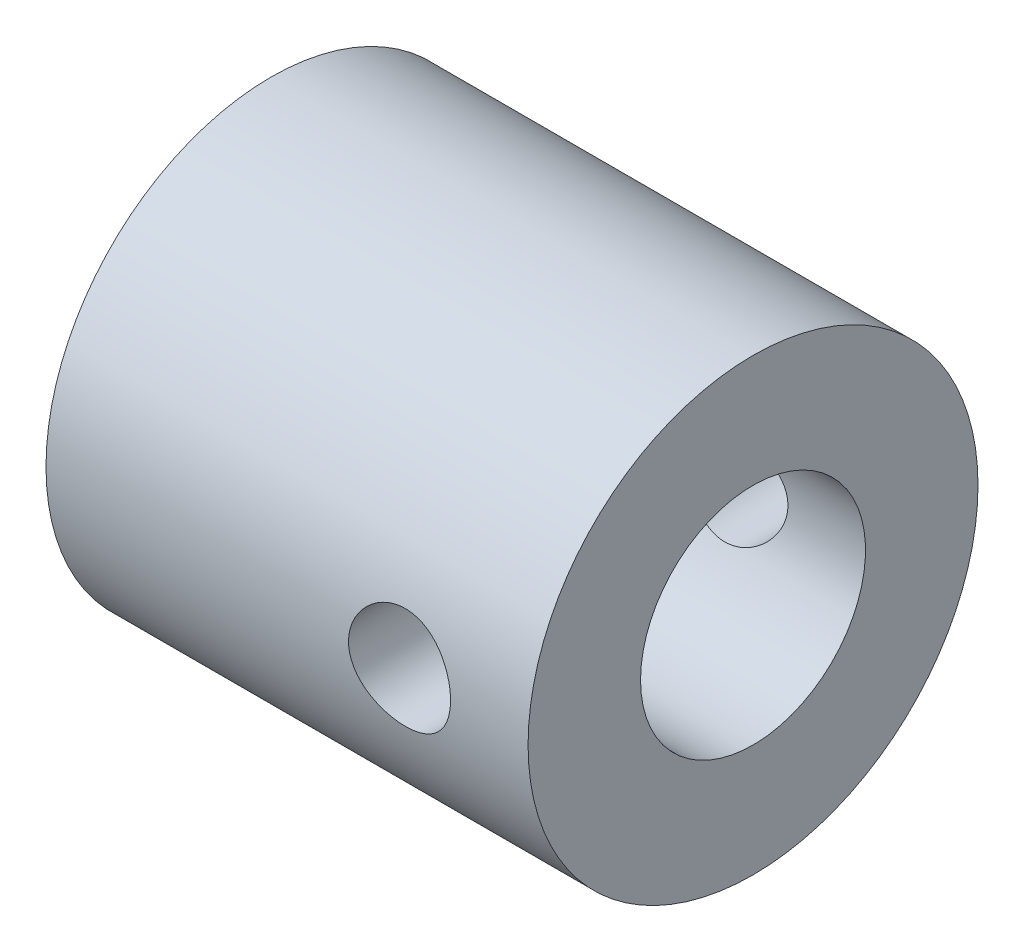
ISO-10303-21;
HEADER;
FILE_DESCRIPTION(('STEP AP214'),'2;1');
FILE_NAME('part.step','',(''),(''),'','','');
FILE_SCHEMA(('AUTOMOTIVE_DESIGN { 1 0 10303 214 1 1 1 1 }'));
ENDSEC;
DATA;
#1=APPLICATION_CONTEXT('core data for automotive mechanical design processes');
#2=APPLICATION_PROTOCOL_DEFINITION('international standard','automotive_design',2000,#1);
#3=PRODUCT_CONTEXT('',#1,'mechanical');
#4=PRODUCT('Part','Part','',(#3));
#5=PRODUCT_RELATED_PRODUCT_CATEGORY('part','',(#4));
#6=PRODUCT_DEFINITION_FORMATION('','',#4);
#7=PRODUCT_DEFINITION_CONTEXT('part definition',#1,'design');
#8=PRODUCT_DEFINITION('design','',#6,#7);
#9=PRODUCT_DEFINITION_SHAPE('','',#8);
#10=(LENGTH_UNIT() NAMED_UNIT(*) SI_UNIT(.MILLI.,.METRE.));
#11=(NAMED_UNIT(*) PLANE_ANGLE_UNIT() SI_UNIT($,.RADIAN.));
#12=(NAMED_UNIT(*) SI_UNIT($,.STERADIAN.) SOLID_ANGLE_UNIT());
#13=UNCERTAINTY_MEASURE_WITH_UNIT(LENGTH_MEASURE(1.E-05),#10,'distance_accuracy_value','');
#14=(GEOMETRIC_REPRESENTATION_CONTEXT(3) GLOBAL_UNCERTAINTY_ASSIGNED_CONTEXT((#13)) GLOBAL_UNIT_ASSIGNED_CONTEXT((#10,
#11,#12)) REPRESENTATION_CONTEXT('',''));
#15=CARTESIAN_POINT('',(0.,0.,0.));
#16=DIRECTION('',(0.,0.,1.));
#17=DIRECTION('',(1.,0.,0.));
#18=AXIS2_PLACEMENT_3D('',#15,#16,#17);
#19=CARTESIAN_POINT('',(0.,0.,0.));
#20=DIRECTION('',(1.,0.,0.));
#21=DIRECTION('',(0.,0.,-1.));
#22=AXIS2_PLACEMENT_3D('',#19,#20,#21);
#23=PLANE('',#22);
#24=CARTESIAN_POINT('',(0.,0.,0.));
#25=DIRECTION('',(-1.,0.,0.));
#26=DIRECTION('',(0.,0.,1.));
#27=AXIS2_PLACEMENT_3D('',#24,#25,#26);
#28=CIRCLE('',#27,1.75);
#29=CARTESIAN_POINT('',(0.,0.,1.75));
#30=VERTEX_POINT('',#29);
#31=EDGE_CURVE('E53',#30,#30,#28,.T.);
#32=ORIENTED_EDGE('',*,*,#31,.F.);
#33=EDGE_LOOP('',(#32));
#34=FACE_BOUND('',#33,.T.);
#35=CARTESIAN_POINT('',(0.,0.,0.));
#36=DIRECTION('',(-1.,0.,0.));
#37=DIRECTION('',(0.,0.,1.));
#38=AXIS2_PLACEMENT_3D('',#35,#36,#37);
#39=CIRCLE('',#38,3.5);
#40=CARTESIAN_POINT('',(0.,0.,3.5));
#41=VERTEX_POINT('',#40);
#42=EDGE_CURVE('E10',#41,#41,#39,.T.);
#43=ORIENTED_EDGE('',*,*,#42,.T.);
#44=EDGE_LOOP('',(#43));
#45=FACE_BOUND('',#44,.T.);
#46=ADVANCED_FACE('F32',(#34,#45),#23,.F.);
#47=CARTESIAN_POINT('',(-11.7018072289157,0.,0.));
#48=DIRECTION('',(-1.,0.,0.));
#49=DIRECTION('',(0.,0.,1.));
#50=AXIS2_PLACEMENT_3D('',#47,#48,#49);
#51=CYLINDRICAL_SURFACE('',#50,3.5);
#52=CARTESIAN_POINT('',(6.29375,0.,-3.5));
#53=CARTESIAN_POINT('',(6.29374855727983,0.0439820973835995,-3.49999919710545));
#54=CARTESIAN_POINT('',(6.29008206040973,0.0879812840733383,-3.49916257597233));
#55=CARTESIAN_POINT('',(6.27552981927787,0.174727100182892,-3.49590599484223));
#56=CARTESIAN_POINT('',(6.26463917915304,0.217472859615886,-3.49348496109034));
#57=CARTESIAN_POINT('',(6.23599949833412,0.300445871733112,-3.48732875851884));
#58=CARTESIAN_POINT('',(6.21825788893495,0.340675798606958,-3.48359501399745));
#59=CARTESIAN_POINT('',(6.17644412191925,0.417587052196539,-3.47521504585639));
#60=CARTESIAN_POINT('',(6.15237203316466,0.454268417507019,-3.47056883216255));
#61=CARTESIAN_POINT('',(6.09814331919243,0.523672303057422,-3.46078257177766));
#62=CARTESIAN_POINT('',(6.06789870619318,0.556325162628983,-3.45563602229211));
#63=CARTESIAN_POINT('',(6.00237224629757,0.616140759392463,-3.44547429872514));
#64=CARTESIAN_POINT('',(5.96708992336556,0.643302977162551,-3.44045913711221));
#65=CARTESIAN_POINT('',(5.89196817718924,0.691678558795009,-3.43106357880617));
#66=CARTESIAN_POINT('',(5.85207927004759,0.712816839598449,-3.42669149693305));
#67=CARTESIAN_POINT('',(5.76919967446594,0.74806259528995,-3.4191708504515));
#68=CARTESIAN_POINT('',(5.72620938780848,0.762170979032749,-3.41602212769364));
#69=CARTESIAN_POINT('',(5.63910566720977,0.782724398668141,-3.41137109858007));
#70=CARTESIAN_POINT('',(5.59502290039657,0.789293255645327,-3.40984222282115));
#71=CARTESIAN_POINT('',(5.50635655954504,0.794966336480359,-3.40852426432603));
#72=CARTESIAN_POINT('',(5.46177305265198,0.794071549496008,-3.40873495104534));
#73=CARTESIAN_POINT('',(5.3742981565267,0.784942175352693,-3.41084829961255));
#74=CARTESIAN_POINT('',(5.33139073318855,0.776852319331071,-3.41271759624172));
#75=CARTESIAN_POINT('',(5.24755842884625,0.753792133796847,-3.41788468772046));
#76=CARTESIAN_POINT('',(5.20663366668407,0.738821392402323,-3.42118256808274));
#77=CARTESIAN_POINT('',(5.12752615489497,0.702293886420758,-3.42886755925631));
#78=CARTESIAN_POINT('',(5.08936965675742,0.680682245169375,-3.4332636865183));
#79=CARTESIAN_POINT('',(5.01717159294893,0.631524945671162,-3.44264441995016));
#80=CARTESIAN_POINT('',(4.98313062897744,0.603978421366282,-3.44762911195932));
#81=CARTESIAN_POINT('',(4.91929757654477,0.542971196173452,-3.45776783402925));
#82=CARTESIAN_POINT('',(4.88962297213627,0.509387645930899,-3.46292310347589));
#83=CARTESIAN_POINT('',(4.8363070384123,0.437661408754213,-3.47271659942028));
#84=CARTESIAN_POINT('',(4.81266583489726,0.399518626781398,-3.47735481513598));
#85=CARTESIAN_POINT('',(4.77205535461307,0.31960733455981,-3.48560848012774));
#86=CARTESIAN_POINT('',(4.75510237451547,0.27783026726404,-3.48922142527346));
#87=CARTESIAN_POINT('',(4.72849037083475,0.191919973053626,-3.49499898310452));
#88=CARTESIAN_POINT('',(4.71883020506269,0.147787116258733,-3.49716382258382));
#89=CARTESIAN_POINT('',(4.70725101542057,0.0594249376514254,-3.49976865280915));
#90=CARTESIAN_POINT('',(4.70517163407018,0.015217653794721,-3.50024436811952));
#91=CARTESIAN_POINT('',(4.70837712739556,-0.0729126951091739,-3.49951786228906));
#92=CARTESIAN_POINT('',(4.71366146299163,-0.116835780725337,-3.49831576397686));
#93=CARTESIAN_POINT('',(4.73131157809485,-0.202613228676585,-3.49439133381633));
#94=CARTESIAN_POINT('',(4.74359241825685,-0.244485977768459,-3.49168724618119));
#95=CARTESIAN_POINT('',(4.7747919847149,-0.32557671415823,-3.48506189133682));
#96=CARTESIAN_POINT('',(4.79371130485242,-0.364794463580098,-3.48114051523937));
#97=CARTESIAN_POINT('',(4.83797910901282,-0.44011892381613,-3.47242797959283));
#98=CARTESIAN_POINT('',(4.86342072290787,-0.476169449309036,-3.4676245338343));
#99=CARTESIAN_POINT('',(4.9198891935963,-0.543546928350725,-3.45770423165649));
#100=CARTESIAN_POINT('',(4.95091683410922,-0.574873217954432,-3.45258733132609));
#101=CARTESIAN_POINT('',(5.0184148236,-0.632553702758539,-3.44249212006097));
#102=CARTESIAN_POINT('',(5.05498125081784,-0.658796465573274,-3.43751859792229));
#103=CARTESIAN_POINT('',(5.13209605206699,-0.704769791909395,-3.42838899413945));
#104=CARTESIAN_POINT('',(5.17264425014468,-0.724500643022879,-3.42423287639872));
#105=CARTESIAN_POINT('',(5.25635119068739,-0.756752244413085,-3.41725014054271));
#106=CARTESIAN_POINT('',(5.29949326757288,-0.769314512643995,-3.41441588449903));
#107=CARTESIAN_POINT('',(5.38734915758501,-0.786991557377743,-3.4103853157804));
#108=CARTESIAN_POINT('',(5.43206269606309,-0.792107628708456,-3.40918871833324));
#109=CARTESIAN_POINT('',(5.52066633239016,-0.794688765745591,-3.40858784173679));
#110=CARTESIAN_POINT('',(5.56455108410247,-0.792330827575014,-3.40914209857741));
#111=CARTESIAN_POINT('',(5.65128024952136,-0.780428876076294,-3.41188619049372));
#112=CARTESIAN_POINT('',(5.69412467743769,-0.77088496095817,-3.41407600321644));
#113=CARTESIAN_POINT('',(5.77740365895492,-0.744970343867434,-3.4198235213232));
#114=CARTESIAN_POINT('',(5.81784720719575,-0.728627237566223,-3.42337569284109));
#115=CARTESIAN_POINT('',(5.89544397463914,-0.68960121372098,-3.4314494735358));
#116=CARTESIAN_POINT('',(5.93259682121965,-0.666917579413854,-3.43597119230132));
#117=CARTESIAN_POINT('',(6.003425922991,-0.615275289575542,-3.44559706508927));
#118=CARTESIAN_POINT('',(6.03700938077455,-0.586191292681655,-3.45071171813055));
#119=CARTESIAN_POINT('',(6.09887701685518,-0.522825542983406,-3.46087866739419));
#120=CARTESIAN_POINT('',(6.12715996248357,-0.48854258447192,-3.46593094885708));
#121=CARTESIAN_POINT('',(6.17800958217181,-0.415165945495225,-3.47548901544198));
#122=CARTESIAN_POINT('',(6.2004895280904,-0.376010951482678,-3.47998603701271));
#123=CARTESIAN_POINT('',(6.23851296465309,-0.294383022455125,-3.4878380085941));
#124=CARTESIAN_POINT('',(6.25406206900622,-0.25191280552791,-3.49119388236522));
#125=CARTESIAN_POINT('',(6.27512321409947,-0.17452243287632,-3.49581147064442));
#126=CARTESIAN_POINT('',(6.28209451296618,-0.140009780190337,-3.49737218680097));
#127=CARTESIAN_POINT('',(6.29140836498416,-0.0703350393240771,-3.49946674638448));
#128=CARTESIAN_POINT('',(6.29375115375976,-0.0351729842950182,-3.50000064208392));
#129=CARTESIAN_POINT('',(6.29375,0.,-3.5));
#130=B_SPLINE_CURVE_WITH_KNOTS('',3,(#52,#53,#54,#55,#56,#57,#58,#59,#60,#61,#62,#63,#64,#65,
#66,#67,#68,#69,#70,#71,#72,#73,#74,#75,#76,#77,#78,#79,#80,#81,#82,#83,#84,#85,#86,#87,#88,#89,
#90,#91,#92,#93,#94,#95,#96,#97,#98,#99,#100,#101,#102,#103,#104,#105,#106,#107,#108,#109,#110,
#111,#112,#113,#114,#115,#116,#117,#118,#119,#120,#121,#122,#123,#124,#125,#126,#127,#128,#129),
.UNSPECIFIED.,.T.,.F.,(4,2,2,2,2,2,2,2,2,2,2,2,2,2,2,2,2,2,2,2,2,2,2,2,2,2,2,2,2,2,2,2,2,2,2,2,
2,2,4),(0.,0.131817509453098,0.263724444143176,0.395488698548928,0.527251519703591,
0.66104336146815,0.794847854197114,0.930253651143937,1.06564193771329,1.19877342127077,
1.33188726117406,1.46238255209706,1.59288565533631,1.72449756301771,1.85612868941787,
1.99082692831269,2.12552797552631,2.26055524056441,2.39556135345776,2.52769452752618,
2.65981802895662,2.79037069342686,2.92093503939068,3.05347900599933,3.18604158303931,
3.3212439070727,3.45644025923075,3.59084543952858,3.72522724515914,3.8564506641572,
3.98767228977065,4.11836644712653,4.24907538474363,4.38261712183997,4.51618987650609,
4.65165637501728,4.78701295072384,4.89243428145789,4.99785024535258),.UNSPECIFIED.);
#131=CARTESIAN_POINT('',(6.29375,0.,-3.5));
#132=VERTEX_POINT('',#131);
#133=EDGE_CURVE('E75',#132,#132,#130,.T.);
#134=ORIENTED_EDGE('',*,*,#133,.T.);
#135=EDGE_LOOP('',(#134));
#136=FACE_BOUND('',#135,.T.);
#137=CARTESIAN_POINT('',(6.29375,0.,3.5));
#138=CARTESIAN_POINT('',(6.29374855727983,-0.0439820973835996,3.49999919710545));
#139=CARTESIAN_POINT('',(6.29008206040973,-0.0879812840733384,3.49916257597233));
#140=CARTESIAN_POINT('',(6.27552981927787,-0.174727100182892,3.49590599484223));
#141=CARTESIAN_POINT('',(6.26463917915304,-0.217472859615886,3.49348496109034));
#142=CARTESIAN_POINT('',(6.23599949833412,-0.300445871733112,3.48732875851884));
#143=CARTESIAN_POINT('',(6.21825788893495,-0.340675798606958,3.48359501399744));
#144=CARTESIAN_POINT('',(6.17644412191925,-0.41758705219654,3.47521504585639));
#145=CARTESIAN_POINT('',(6.15237203316466,-0.454268417507019,3.47056883216255));
#146=CARTESIAN_POINT('',(6.09814331919243,-0.523672303057423,3.46078257177766));
#147=CARTESIAN_POINT('',(6.06789870619318,-0.556325162628983,3.45563602229211));
#148=CARTESIAN_POINT('',(6.00237224629757,-0.616140759392463,3.44547429872514));
#149=CARTESIAN_POINT('',(5.96708992336556,-0.643302977162551,3.44045913711221));
#150=CARTESIAN_POINT('',(5.89196817718924,-0.69167855879501,3.43106357880617));
#151=CARTESIAN_POINT('',(5.85207927004759,-0.712816839598449,3.42669149693305));
#152=CARTESIAN_POINT('',(5.76919967446594,-0.74806259528995,3.4191708504515));
#153=CARTESIAN_POINT('',(5.72620938780848,-0.762170979032749,3.41602212769364));
#154=CARTESIAN_POINT('',(5.63910566720977,-0.782724398668142,3.41137109858007));
#155=CARTESIAN_POINT('',(5.59502290039657,-0.789293255645327,3.40984222282115));
#156=CARTESIAN_POINT('',(5.50635655954504,-0.794966336480359,3.40852426432603));
#157=CARTESIAN_POINT('',(5.46177305265198,-0.794071549496008,3.40873495104534));
#158=CARTESIAN_POINT('',(5.3742981565267,-0.784942175352693,3.41084829961256));
#159=CARTESIAN_POINT('',(5.33139073318855,-0.776852319331071,3.41271759624172));
#160=CARTESIAN_POINT('',(5.24755842884625,-0.753792133796847,3.41788468772046));
#161=CARTESIAN_POINT('',(5.20663366668407,-0.738821392402323,3.42118256808274));
#162=CARTESIAN_POINT('',(5.12752615489497,-0.702293886420758,3.42886755925631));
#163=CARTESIAN_POINT('',(5.08936965675742,-0.680682245169375,3.4332636865183));
#164=CARTESIAN_POINT('',(5.01717159294893,-0.631524945671162,3.44264441995016));
#165=CARTESIAN_POINT('',(4.98313062897744,-0.603978421366282,3.44762911195932));
#166=CARTESIAN_POINT('',(4.91929757654477,-0.542971196173452,3.45776783402925));
#167=CARTESIAN_POINT('',(4.88962297213627,-0.509387645930899,3.46292310347589));
#168=CARTESIAN_POINT('',(4.8363070384123,-0.437661408754213,3.47271659942028));
#169=CARTESIAN_POINT('',(4.81266583489726,-0.399518626781398,3.47735481513598));
#170=CARTESIAN_POINT('',(4.77205535461307,-0.31960733455981,3.48560848012774));
#171=CARTESIAN_POINT('',(4.75510237451547,-0.27783026726404,3.48922142527346));
#172=CARTESIAN_POINT('',(4.72849037083475,-0.191919973053626,3.49499898310452));
#173=CARTESIAN_POINT('',(4.71883020506269,-0.147787116258733,3.49716382258382));
#174=CARTESIAN_POINT('',(4.70725101542057,-0.059424937651425,3.49976865280915));
#175=CARTESIAN_POINT('',(4.70517163407018,-0.0152176537947208,3.50024436811952));
#176=CARTESIAN_POINT('',(4.70837712739556,0.072912695109174,3.49951786228906));
#177=CARTESIAN_POINT('',(4.71366146299163,0.116835780725337,3.49831576397686));
#178=CARTESIAN_POINT('',(4.73131157809485,0.202613228676585,3.49439133381633));
#179=CARTESIAN_POINT('',(4.74359241825685,0.244485977768459,3.49168724618119));
#180=CARTESIAN_POINT('',(4.7747919847149,0.32557671415823,3.48506189133682));
#181=CARTESIAN_POINT('',(4.79371130485242,0.364794463580098,3.48114051523937));
#182=CARTESIAN_POINT('',(4.83797910901282,0.440118923816131,3.47242797959283));
#183=CARTESIAN_POINT('',(4.86342072290787,0.476169449309036,3.4676245338343));
#184=CARTESIAN_POINT('',(4.9198891935963,0.543546928350726,3.45770423165649));
#185=CARTESIAN_POINT('',(4.95091683410922,0.574873217954433,3.45258733132609));
#186=CARTESIAN_POINT('',(5.0184148236,0.632553702758539,3.44249212006097));
#187=CARTESIAN_POINT('',(5.05498125081785,0.658796465573275,3.43751859792229));
#188=CARTESIAN_POINT('',(5.13209605206699,0.704769791909395,3.42838899413945));
#189=CARTESIAN_POINT('',(5.17264425014468,0.724500643022879,3.42423287639872));
#190=CARTESIAN_POINT('',(5.25635119068739,0.756752244413085,3.41725014054271));
#191=CARTESIAN_POINT('',(5.29949326757288,0.769314512643995,3.41441588449903));
#192=CARTESIAN_POINT('',(5.38734915758501,0.786991557377743,3.4103853157804));
#193=CARTESIAN_POINT('',(5.43206269606309,0.792107628708456,3.40918871833324));
#194=CARTESIAN_POINT('',(5.52066633239016,0.794688765745591,3.40858784173679));
#195=CARTESIAN_POINT('',(5.56455108410247,0.792330827575014,3.40914209857741));
#196=CARTESIAN_POINT('',(5.65128024952136,0.780428876076294,3.41188619049372));
#197=CARTESIAN_POINT('',(5.69412467743769,0.77088496095817,3.41407600321644));
#198=CARTESIAN_POINT('',(5.77740365895492,0.744970343867434,3.4198235213232));
#199=CARTESIAN_POINT('',(5.81784720719575,0.728627237566223,3.42337569284109));
#200=CARTESIAN_POINT('',(5.89544397463914,0.68960121372098,3.4314494735358));
#201=CARTESIAN_POINT('',(5.93259682121965,0.666917579413854,3.43597119230132));
#202=CARTESIAN_POINT('',(6.003425922991,0.615275289575542,3.44559706508927));
#203=CARTESIAN_POINT('',(6.03700938077455,0.586191292681655,3.45071171813055));
#204=CARTESIAN_POINT('',(6.09887701685518,0.522825542983406,3.46087866739419));
#205=CARTESIAN_POINT('',(6.12715996248357,0.48854258447192,3.46593094885708));
#206=CARTESIAN_POINT('',(6.17800958217181,0.415165945495225,3.47548901544198));
#207=CARTESIAN_POINT('',(6.2004895280904,0.376010951482678,3.47998603701271));
#208=CARTESIAN_POINT('',(6.23851296465309,0.294383022455125,3.4878380085941));
#209=CARTESIAN_POINT('',(6.25406206900622,0.25191280552791,3.49119388236521));
#210=CARTESIAN_POINT('',(6.27512321409947,0.17452243287632,3.49581147064442));
#211=CARTESIAN_POINT('',(6.28209451296618,0.140009780190337,3.49737218680097));
#212=CARTESIAN_POINT('',(6.29140836498416,0.0703350393240772,3.49946674638448));
#213=CARTESIAN_POINT('',(6.29375115375976,0.0351729842950182,3.50000064208392));
#214=CARTESIAN_POINT('',(6.29375,0.,3.5));
#215=B_SPLINE_CURVE_WITH_KNOTS('',3,(#137,#138,#139,#140,#141,#142,#143,#144,#145,#146,#147,
#148,#149,#150,#151,#152,#153,#154,#155,#156,#157,#158,#159,#160,#161,#162,#163,#164,#165,#166,
#167,#168,#169,#170,#171,#172,#173,#174,#175,#176,#177,#178,#179,#180,#181,#182,#183,#184,#185,
#186,#187,#188,#189,#190,#191,#192,#193,#194,#195,#196,#197,#198,#199,#200,#201,#202,#203,#204,
#205,#206,#207,#208,#209,#210,#211,#212,#213,#214),.UNSPECIFIED.,.T.,.F.,(4,2,2,2,2,2,2,2,2,2,2,
2,2,2,2,2,2,2,2,2,2,2,2,2,2,2,2,2,2,2,2,2,2,2,2,2,2,2,4),(0.,0.131817509453098,
0.263724444143176,0.395488698548928,0.527251519703591,0.661043361468149,0.794847854197114,
0.930253651143937,1.06564193771329,1.19877342127077,1.33188726117406,1.46238255209706,
1.59288565533631,1.72449756301771,1.85612868941787,1.99082692831269,2.12552797552631,
2.26055524056441,2.39556135345776,2.52769452752618,2.65981802895662,2.79037069342686,
2.92093503939068,3.05347900599933,3.18604158303932,3.3212439070727,3.45644025923075,
3.59084543952858,3.72522724515914,3.8564506641572,3.98767228977065,4.11836644712653,
4.24907538474363,4.38261712183997,4.51618987650609,4.65165637501728,4.78701295072384,
4.89243428145789,4.99785024535258),.UNSPECIFIED.);
#216=CARTESIAN_POINT('',(6.29375,0.,3.5));
#217=VERTEX_POINT('',#216);
#218=EDGE_CURVE('E71',#217,#217,#215,.T.);
#219=ORIENTED_EDGE('',*,*,#218,.T.);
#220=EDGE_LOOP('',(#219));
#221=FACE_BOUND('',#220,.T.);
#222=ORIENTED_EDGE('',*,*,#42,.F.);
#223=EDGE_LOOP('',(#222));
#224=FACE_BOUND('',#223,.T.);
#225=CARTESIAN_POINT('',(7.5,0.,0.));
#226=DIRECTION('',(-1.,0.,0.));
#227=DIRECTION('',(0.,0.,1.));
#228=AXIS2_PLACEMENT_3D('',#225,#226,#227);
#229=CIRCLE('',#228,3.5);
#230=CARTESIAN_POINT('',(7.5,0.,3.5));
#231=VERTEX_POINT('',#230);
#232=EDGE_CURVE('E43',#231,#231,#229,.T.);
#233=ORIENTED_EDGE('',*,*,#232,.T.);
#234=EDGE_LOOP('',(#233));
#235=FACE_BOUND('',#234,.T.);
#236=ADVANCED_FACE('F78',(#136,#221,#224,#235),#51,.T.);
#237=CARTESIAN_POINT('',(7.5,0.,0.));
#238=DIRECTION('',(-1.,0.,0.));
#239=DIRECTION('',(0.,0.,1.));
#240=AXIS2_PLACEMENT_3D('',#237,#238,#239);
#241=PLANE('',#240);
#242=CARTESIAN_POINT('',(7.5,0.,0.));
#243=DIRECTION('',(-1.,0.,0.));
#244=DIRECTION('',(0.,0.,1.));
#245=AXIS2_PLACEMENT_3D('',#242,#243,#244);
#246=CIRCLE('',#245,1.75);
#247=CARTESIAN_POINT('',(7.5,0.,1.75));
#248=VERTEX_POINT('',#247);
#249=EDGE_CURVE('E48',#248,#248,#246,.T.);
#250=ORIENTED_EDGE('',*,*,#249,.T.);
#251=EDGE_LOOP('',(#250));
#252=FACE_BOUND('',#251,.T.);
#253=ORIENTED_EDGE('',*,*,#232,.F.);
#254=EDGE_LOOP('',(#253));
#255=FACE_BOUND('',#254,.T.);
#256=ADVANCED_FACE('F81',(#252,#255),#241,.F.);
#257=CARTESIAN_POINT('',(10.,0.,0.));
#258=DIRECTION('',(-1.,0.,0.));
#259=DIRECTION('',(0.,0.,1.));
#260=AXIS2_PLACEMENT_3D('',#257,#258,#259);
#261=CYLINDRICAL_SURFACE('',#260,1.75);
#262=CARTESIAN_POINT('',(6.29375,0.,1.75));
#263=CARTESIAN_POINT('',(6.29374501124852,0.0421881518719503,1.74999612992706));
#264=CARTESIAN_POINT('',(6.29036740075506,0.0844240233419937,1.74845757189419));
#265=CARTESIAN_POINT('',(6.27698639353736,0.167683820977794,1.74245085953981));
#266=CARTESIAN_POINT('',(6.26696757106883,0.208704692738086,1.73797588495934));
#267=CARTESIAN_POINT('',(6.24076382239906,0.288187973002068,1.72657281587176));
#268=CARTESIAN_POINT('',(6.22460124335122,0.326659067357293,1.71965361829561));
#269=CARTESIAN_POINT('',(6.18667012079756,0.400299931554007,1.70401847656605));
#270=CARTESIAN_POINT('',(6.16490271622051,0.435470370126501,1.69530289751808));
#271=CARTESIAN_POINT('',(6.1150703366536,0.503587604898433,1.67636929960287));
#272=CARTESIAN_POINT('',(6.08673511166361,0.536321275309252,1.66609648005545));
#273=CARTESIAN_POINT('',(6.02514620115783,0.59676133334333,1.64541734362848));
#274=CARTESIAN_POINT('',(5.99188948451964,0.624464599180185,1.63501094811325));
#275=CARTESIAN_POINT('',(5.91896356035179,0.675731448524973,1.6145264024747));
#276=CARTESIAN_POINT('',(5.87902755476577,0.698941384080949,1.60450658208025));
#277=CARTESIAN_POINT('',(5.7953040468456,0.738220104710765,1.58682023458879));
#278=CARTESIAN_POINT('',(5.751518899293,0.754293219939473,1.57915228140873));
#279=CARTESIAN_POINT('',(5.66378492051401,0.777922640797912,1.56764209486603));
#280=CARTESIAN_POINT('',(5.61997250735923,0.785891848617099,1.56361569264893));
#281=CARTESIAN_POINT('',(5.53146192888595,0.794368846960818,1.55932781154677));
#282=CARTESIAN_POINT('',(5.48676441648534,0.794881946382385,1.55906365387164));
#283=CARTESIAN_POINT('',(5.40225228418697,0.788739175224582,1.56217727884384));
#284=CARTESIAN_POINT('',(5.36237373710314,0.782752890026493,1.56521493335517));
#285=CARTESIAN_POINT('',(5.28426433759867,0.764920072865145,1.57400605342639));
#286=CARTESIAN_POINT('',(5.2460338784801,0.753072150396764,1.5797601633725));
#287=CARTESIAN_POINT('',(5.17126286413605,0.723618077372438,1.59346942488218));
#288=CARTESIAN_POINT('',(5.13478049755182,0.705887125113806,1.60147164752788));
#289=CARTESIAN_POINT('',(5.06515090709687,0.665260749483225,1.61876957097724));
#290=CARTESIAN_POINT('',(5.03200512029691,0.642363114458379,1.62806582504988));
#291=CARTESIAN_POINT('',(4.96643362791889,0.589321879094515,1.64805372831711));
#292=CARTESIAN_POINT('',(4.93442551933804,0.558677658510185,1.65879103640574));
#293=CARTESIAN_POINT('',(4.87584786758519,0.492372690634504,1.67966566746727));
#294=CARTESIAN_POINT('',(4.84928010530549,0.456710307077042,1.68980279320155));
#295=CARTESIAN_POINT('',(4.80156341937541,0.379910856998411,1.70873607217359));
#296=CARTESIAN_POINT('',(4.7806146235034,0.338635334555614,1.71747906814299));
#297=CARTESIAN_POINT('',(4.74610982729804,0.252647517116055,1.73221433803184));
#298=CARTESIAN_POINT('',(4.73254897180436,0.207937501277875,1.7382084180558));
#299=CARTESIAN_POINT('',(4.71414885504718,0.119812204176172,1.74641364671074));
#300=CARTESIAN_POINT('',(4.70875109936689,0.0765361172129783,1.74886645504382));
#301=CARTESIAN_POINT('',(4.70512835519437,-0.0103706687020665,1.75050807981353));
#302=CARTESIAN_POINT('',(4.7069007930195,-0.0540012348054555,1.74969806741356));
#303=CARTESIAN_POINT('',(4.71719726239186,-0.13756101449896,1.74505663397325));
#304=CARTESIAN_POINT('',(4.72530240659768,-0.177553557545054,1.74141273213714));
#305=CARTESIAN_POINT('',(4.74742029571545,-0.255551863967045,1.73168670413329));
#306=CARTESIAN_POINT('',(4.76143374795722,-0.29355738884891,1.72560428603596));
#307=CARTESIAN_POINT('',(4.79540896745995,-0.367846348779023,1.71133425034669));
#308=CARTESIAN_POINT('',(4.8155418967427,-0.404039690008154,1.70308713812592));
#309=CARTESIAN_POINT('',(4.86099803811341,-0.47266419809048,1.68533289108933));
#310=CARTESIAN_POINT('',(4.88632352520833,-0.505093706115096,1.6758252046275));
#311=CARTESIAN_POINT('',(4.94390812653422,-0.568130382727787,1.65557046619109));
#312=CARTESIAN_POINT('',(4.97656983210734,-0.598358719062775,1.64478624418049));
#313=CARTESIAN_POINT('',(5.04662004554883,-0.653039792801156,1.6238528867771));
#314=CARTESIAN_POINT('',(5.0840104482354,-0.677490203625066,1.61370400842121));
#315=CARTESIAN_POINT('',(5.16380038661143,-0.720497308165294,1.59497662558113));
#316=CARTESIAN_POINT('',(5.20630788249109,-0.738877116638308,1.58644789932467));
#317=CARTESIAN_POINT('',(5.29432856088342,-0.768037711148969,1.57254049761336));
#318=CARTESIAN_POINT('',(5.33983859111016,-0.778826332380152,1.5671585751788));
#319=CARTESIAN_POINT('',(5.42830780289953,-0.791656578518695,1.56071352488667));
#320=CARTESIAN_POINT('',(5.47114399930744,-0.794378100237154,1.55931511840842));
#321=CARTESIAN_POINT('',(5.55665710988771,-0.79287844768848,1.56007851671157));
#322=CARTESIAN_POINT('',(5.59933405960823,-0.78865892889782,1.56223947256557));
#323=CARTESIAN_POINT('',(5.68041941135304,-0.773999577820085,1.569549016298));
#324=CARTESIAN_POINT('',(5.71892471670139,-0.763983166684707,1.57449366319469));
#325=CARTESIAN_POINT('',(5.79369825313775,-0.73847280318054,1.58661785939495));
#326=CARTESIAN_POINT('',(5.82996582669426,-0.722977249747267,1.59379806187863));
#327=CARTESIAN_POINT('',(5.90182374861376,-0.685797689269468,1.61016114863855));
#328=CARTESIAN_POINT('',(5.9372163565733,-0.66377652229011,1.61944396797901));
#329=CARTESIAN_POINT('',(6.00401438207964,-0.614597815630458,1.63873942951869));
#330=CARTESIAN_POINT('',(6.03541803943025,-0.58743802150784,1.6487523908597));
#331=CARTESIAN_POINT('',(6.09635557563444,-0.525782223712345,1.66949242946721));
#332=CARTESIAN_POINT('',(6.12544671633006,-0.490839680440168,1.6801997279623));
#333=CARTESIAN_POINT('',(6.17740731736054,-0.416203656992764,1.70022515417021));
#334=CARTESIAN_POINT('',(6.20027390024561,-0.37650799174126,1.7095426385118));
#335=CARTESIAN_POINT('',(6.23880085013592,-0.293730979758415,1.72568368114506));
#336=CARTESIAN_POINT('',(6.25452464811904,-0.250683577531187,1.73252907631529));
#337=CARTESIAN_POINT('',(6.27833190739659,-0.162241467755769,1.74302742466285));
#338=CARTESIAN_POINT('',(6.28643845070541,-0.116854294086043,1.7466900198954));
#339=CARTESIAN_POINT('',(6.29268750232156,-0.0474686585451847,1.7495183186665));
#340=CARTESIAN_POINT('',(6.29375280747941,-0.0237418856945198,1.75000217792971));
#341=CARTESIAN_POINT('',(6.29375,0.,1.75));
#342=B_SPLINE_CURVE_WITH_KNOTS('',3,(#262,#263,#264,#265,#266,#267,#268,#269,#270,#271,#272,
#273,#274,#275,#276,#277,#278,#279,#280,#281,#282,#283,#284,#285,#286,#287,#288,#289,#290,#291,
#292,#293,#294,#295,#296,#297,#298,#299,#300,#301,#302,#303,#304,#305,#306,#307,#308,#309,#310,
#311,#312,#313,#314,#315,#316,#317,#318,#319,#320,#321,#322,#323,#324,#325,#326,#327,#328,#329,
#330,#331,#332,#333,#334,#335,#336,#337,#338,#339,#340,#341),.UNSPECIFIED.,.T.,.F.,(4,2,2,2,2,2,
2,2,2,2,2,2,2,2,2,2,2,2,2,2,2,2,2,2,2,2,2,2,2,2,2,2,2,2,2,2,2,2,2,4),(0.,0.12648841495121,
0.253271662706137,0.379598097794258,0.505898882945725,0.638818627361472,0.771820579753744,
0.912901011720781,1.05389572796911,1.18727956399196,1.32056842342131,1.44132368337063,
1.56210760278299,1.68563783025459,1.80922103679252,1.9453981622627,2.08161979417675,
2.22219132291051,2.36267035995013,2.4930174873261,2.62331783181311,2.74566153598393,
2.8680198910383,2.99417692472797,3.12038934996148,3.25715027896696,3.39396618359497,
3.53447480012672,3.67483817803937,3.80297835142835,3.93108796710967,4.0508463615378,
4.17063977961968,4.29823065542009,4.42587763883147,4.56535001086665,4.70488674824994,
4.84315887942566,4.98101065042217,5.05219351471467),.UNSPECIFIED.);
#343=CARTESIAN_POINT('',(6.29375,0.,1.75));
#344=VERTEX_POINT('',#343);
#345=EDGE_CURVE('E35',#344,#344,#342,.T.);
#346=ORIENTED_EDGE('',*,*,#345,.T.);
#347=EDGE_LOOP('',(#346));
#348=FACE_BOUND('',#347,.T.);
#349=CARTESIAN_POINT('',(6.29375,0.,-1.75));
#350=CARTESIAN_POINT('',(6.29374501124852,-0.0421881518719502,-1.74999612992706));
#351=CARTESIAN_POINT('',(6.29036740075506,-0.0844240233419935,-1.74845757189419));
#352=CARTESIAN_POINT('',(6.27698639353736,-0.167683820977794,-1.74245085953981));
#353=CARTESIAN_POINT('',(6.26696757106883,-0.208704692738085,-1.73797588495934));
#354=CARTESIAN_POINT('',(6.24076382239906,-0.288187973002068,-1.72657281587176));
#355=CARTESIAN_POINT('',(6.22460124335122,-0.326659067357293,-1.71965361829561));
#356=CARTESIAN_POINT('',(6.18667012079756,-0.400299931554007,-1.70401847656605));
#357=CARTESIAN_POINT('',(6.16490271622051,-0.4354703701265,-1.69530289751808));
#358=CARTESIAN_POINT('',(6.1150703366536,-0.503587604898432,-1.67636929960287));
#359=CARTESIAN_POINT('',(6.08673511166361,-0.536321275309251,-1.66609648005545));
#360=CARTESIAN_POINT('',(6.02514620115783,-0.59676133334333,-1.64541734362848));
#361=CARTESIAN_POINT('',(5.99188948451964,-0.624464599180184,-1.63501094811325));
#362=CARTESIAN_POINT('',(5.91896356035179,-0.675731448524972,-1.6145264024747));
#363=CARTESIAN_POINT('',(5.87902755476577,-0.698941384080949,-1.60450658208025));
#364=CARTESIAN_POINT('',(5.7953040468456,-0.738220104710764,-1.58682023458879));
#365=CARTESIAN_POINT('',(5.751518899293,-0.754293219939472,-1.57915228140873));
#366=CARTESIAN_POINT('',(5.66378492051401,-0.777922640797912,-1.56764209486603));
#367=CARTESIAN_POINT('',(5.61997250735923,-0.785891848617098,-1.56361569264893));
#368=CARTESIAN_POINT('',(5.53146192888595,-0.794368846960818,-1.55932781154677));
#369=CARTESIAN_POINT('',(5.48676441648534,-0.794881946382384,-1.55906365387164));
#370=CARTESIAN_POINT('',(5.40225228418697,-0.788739175224582,-1.56217727884384));
#371=CARTESIAN_POINT('',(5.36237373710314,-0.782752890026493,-1.56521493335517));
#372=CARTESIAN_POINT('',(5.28426433759867,-0.764920072865145,-1.57400605342639));
#373=CARTESIAN_POINT('',(5.2460338784801,-0.753072150396764,-1.5797601633725));
#374=CARTESIAN_POINT('',(5.17126286413605,-0.723618077372438,-1.59346942488218));
#375=CARTESIAN_POINT('',(5.13478049755182,-0.705887125113806,-1.60147164752788));
#376=CARTESIAN_POINT('',(5.06515090709687,-0.665260749483225,-1.61876957097724));
#377=CARTESIAN_POINT('',(5.03200512029691,-0.642363114458379,-1.62806582504988));
#378=CARTESIAN_POINT('',(4.96643362791889,-0.589321879094515,-1.64805372831711));
#379=CARTESIAN_POINT('',(4.93442551933804,-0.558677658510185,-1.65879103640574));
#380=CARTESIAN_POINT('',(4.87584786758519,-0.492372690634504,-1.67966566746727));
#381=CARTESIAN_POINT('',(4.84928010530549,-0.456710307077042,-1.68980279320155));
#382=CARTESIAN_POINT('',(4.80156341937541,-0.379910856998411,-1.70873607217359));
#383=CARTESIAN_POINT('',(4.78061462350339,-0.338635334555614,-1.71747906814299));
#384=CARTESIAN_POINT('',(4.74610982729804,-0.252647517116055,-1.73221433803184));
#385=CARTESIAN_POINT('',(4.73254897180436,-0.207937501277875,-1.7382084180558));
#386=CARTESIAN_POINT('',(4.71414885504718,-0.119812204176171,-1.74641364671074));
#387=CARTESIAN_POINT('',(4.70875109936689,-0.0765361172129779,-1.74886645504382));
#388=CARTESIAN_POINT('',(4.70512835519437,0.010370668702067,-1.75050807981353));
#389=CARTESIAN_POINT('',(4.7069007930195,0.0540012348054561,-1.74969806741356));
#390=CARTESIAN_POINT('',(4.71719726239186,0.137561014498961,-1.74505663397325));
#391=CARTESIAN_POINT('',(4.72530240659768,0.177553557545055,-1.74141273213714));
#392=CARTESIAN_POINT('',(4.74742029571545,0.255551863967046,-1.73168670413329));
#393=CARTESIAN_POINT('',(4.76143374795722,0.29355738884891,-1.72560428603596));
#394=CARTESIAN_POINT('',(4.79540896745995,0.367846348779024,-1.71133425034669));
#395=CARTESIAN_POINT('',(4.8155418967427,0.404039690008154,-1.70308713812592));
#396=CARTESIAN_POINT('',(4.86099803811341,0.47266419809048,-1.68533289108932));
#397=CARTESIAN_POINT('',(4.88632352520833,0.505093706115096,-1.6758252046275));
#398=CARTESIAN_POINT('',(4.94390812653422,0.568130382727787,-1.65557046619109));
#399=CARTESIAN_POINT('',(4.97656983210734,0.598358719062775,-1.64478624418049));
#400=CARTESIAN_POINT('',(5.04662004554883,0.653039792801156,-1.6238528867771));
#401=CARTESIAN_POINT('',(5.0840104482354,0.677490203625066,-1.61370400842121));
#402=CARTESIAN_POINT('',(5.16380038661143,0.720497308165294,-1.59497662558113));
#403=CARTESIAN_POINT('',(5.20630788249109,0.738877116638308,-1.58644789932467));
#404=CARTESIAN_POINT('',(5.29432856088342,0.768037711148969,-1.57254049761336));
#405=CARTESIAN_POINT('',(5.33983859111016,0.778826332380152,-1.5671585751788));
#406=CARTESIAN_POINT('',(5.42830780289953,0.791656578518695,-1.56071352488667));
#407=CARTESIAN_POINT('',(5.47114399930744,0.794378100237154,-1.55931511840842));
#408=CARTESIAN_POINT('',(5.55665710988771,0.79287844768848,-1.56007851671157));
#409=CARTESIAN_POINT('',(5.59933405960823,0.78865892889782,-1.56223947256557));
#410=CARTESIAN_POINT('',(5.68041941135304,0.773999577820085,-1.569549016298));
#411=CARTESIAN_POINT('',(5.71892471670139,0.763983166684707,-1.57449366319469));
#412=CARTESIAN_POINT('',(5.79369825313775,0.73847280318054,-1.58661785939495));
#413=CARTESIAN_POINT('',(5.82996582669426,0.722977249747267,-1.59379806187863));
#414=CARTESIAN_POINT('',(5.90182374861376,0.685797689269468,-1.61016114863854));
#415=CARTESIAN_POINT('',(5.9372163565733,0.66377652229011,-1.61944396797901));
#416=CARTESIAN_POINT('',(6.00401438207964,0.614597815630458,-1.63873942951869));
#417=CARTESIAN_POINT('',(6.03541803943025,0.58743802150784,-1.6487523908597));
#418=CARTESIAN_POINT('',(6.09635557563444,0.525782223712344,-1.66949242946721));
#419=CARTESIAN_POINT('',(6.12544671633006,0.490839680440166,-1.6801997279623));
#420=CARTESIAN_POINT('',(6.17740731736054,0.416203656992763,-1.70022515417021));
#421=CARTESIAN_POINT('',(6.20027390024562,0.376507991741258,-1.7095426385118));
#422=CARTESIAN_POINT('',(6.23880085013592,0.293730979758414,-1.72568368114506));
#423=CARTESIAN_POINT('',(6.25452464811904,0.250683577531186,-1.73252907631529));
#424=CARTESIAN_POINT('',(6.27833190739659,0.162241467755767,-1.74302742466285));
#425=CARTESIAN_POINT('',(6.28643845070541,0.116854294086042,-1.7466900198954));
#426=CARTESIAN_POINT('',(6.29268750232156,0.0474686585451843,-1.7495183186665));
#427=CARTESIAN_POINT('',(6.29375280747941,0.0237418856945195,-1.75000217792971));
#428=CARTESIAN_POINT('',(6.29375,0.,-1.75));
#429=B_SPLINE_CURVE_WITH_KNOTS('',3,(#349,#350,#351,#352,#353,#354,#355,#356,#357,#358,#359,
#360,#361,#362,#363,#364,#365,#366,#367,#368,#369,#370,#371,#372,#373,#374,#375,#376,#377,#378,
#379,#380,#381,#382,#383,#384,#385,#386,#387,#388,#389,#390,#391,#392,#393,#394,#395,#396,#397,
#398,#399,#400,#401,#402,#403,#404,#405,#406,#407,#408,#409,#410,#411,#412,#413,#414,#415,#416,
#417,#418,#419,#420,#421,#422,#423,#424,#425,#426,#427,#428),.UNSPECIFIED.,.T.,.F.,(4,2,2,2,2,2,
2,2,2,2,2,2,2,2,2,2,2,2,2,2,2,2,2,2,2,2,2,2,2,2,2,2,2,2,2,2,2,2,2,4),(0.,0.12648841495121,
0.253271662706137,0.379598097794257,0.505898882945724,0.63881862736147,0.771820579753743,
0.912901011720779,1.05389572796911,1.18727956399196,1.32056842342131,1.44132368337063,
1.56210760278299,1.68563783025459,1.80922103679252,1.9453981622627,2.08161979417675,
2.22219132291051,2.36267035995013,2.4930174873261,2.62331783181311,2.74566153598393,
2.8680198910383,2.99417692472797,3.12038934996148,3.25715027896696,3.39396618359497,
3.53447480012672,3.67483817803937,3.80297835142835,3.93108796710967,4.0508463615378,
4.17063977961968,4.29823065542009,4.42587763883147,4.56535001086665,4.70488674824995,
4.84315887942566,4.98101065042217,5.05219351471467),.UNSPECIFIED.);
#430=CARTESIAN_POINT('',(6.29375,0.,-1.75));
#431=VERTEX_POINT('',#430);
#432=EDGE_CURVE('E54',#431,#431,#429,.T.);
#433=ORIENTED_EDGE('',*,*,#432,.T.);
#434=EDGE_LOOP('',(#433));
#435=FACE_BOUND('',#434,.T.);
#436=ORIENTED_EDGE('',*,*,#31,.T.);
#437=EDGE_LOOP('',(#436));
#438=FACE_BOUND('',#437,.T.);
#439=ORIENTED_EDGE('',*,*,#249,.F.);
#440=EDGE_LOOP('',(#439));
#441=FACE_BOUND('',#440,.T.);
#442=ADVANCED_FACE('F58',(#348,#435,#438,#441),#261,.F.);
#443=CARTESIAN_POINT('',(5.5,0.,-3.5));
#444=DIRECTION('',(0.,0.,1.));
#445=DIRECTION('',(1.,0.,0.));
#446=AXIS2_PLACEMENT_3D('',#443,#444,#445);
#447=CYLINDRICAL_SURFACE('',#446,0.79375);
#448=ORIENTED_EDGE('',*,*,#432,.F.);
#449=EDGE_LOOP('',(#448));
#450=FACE_BOUND('',#449,.T.);
#451=ORIENTED_EDGE('',*,*,#133,.F.);
#452=EDGE_LOOP('',(#451));
#453=FACE_BOUND('',#452,.T.);
#454=ADVANCED_FACE('F61',(#450,#453),#447,.F.);
#455=ORIENTED_EDGE('',*,*,#345,.F.);
#456=EDGE_LOOP('',(#455));
#457=FACE_BOUND('',#456,.T.);
#458=ORIENTED_EDGE('',*,*,#218,.F.);
#459=EDGE_LOOP('',(#458));
#460=FACE_BOUND('',#459,.T.);
#461=ADVANCED_FACE('F64',(#457,#460),#447,.F.);
#462=CLOSED_SHELL('',(#46,#236,#256,#442,#454,#461));
#463=MANIFOLD_SOLID_BREP('B2',#462);
#464=ADVANCED_BREP_SHAPE_REPRESENTATION('',(#18,#463),#14);
#465=SHAPE_DEFINITION_REPRESENTATION(#9,#464);
ENDSEC;
END-ISO-10303-21;
